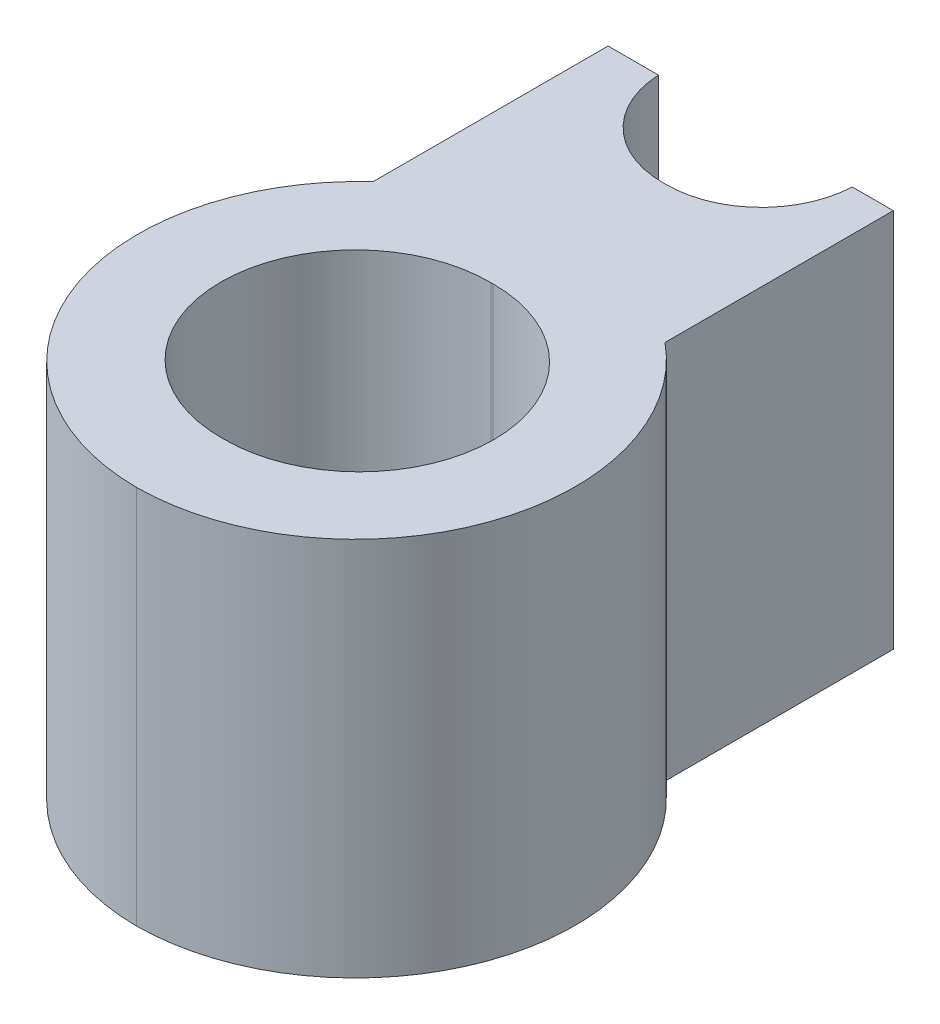
ISO-10303-21;
HEADER;
FILE_DESCRIPTION(('STEP AP214'),'2;1');
FILE_NAME('part.step','',(''),(''),'','','');
FILE_SCHEMA(('AUTOMOTIVE_DESIGN { 1 0 10303 214 1 1 1 1 }'));
ENDSEC;
DATA;
#1=APPLICATION_CONTEXT('core data for automotive mechanical design processes');
#2=APPLICATION_PROTOCOL_DEFINITION('international standard','automotive_design',2000,#1);
#3=PRODUCT_CONTEXT('',#1,'mechanical');
#4=PRODUCT('Part','Part','',(#3));
#5=PRODUCT_RELATED_PRODUCT_CATEGORY('part','',(#4));
#6=PRODUCT_DEFINITION_FORMATION('','',#4);
#7=PRODUCT_DEFINITION_CONTEXT('part definition',#1,'design');
#8=PRODUCT_DEFINITION('design','',#6,#7);
#9=PRODUCT_DEFINITION_SHAPE('','',#8);
#10=(LENGTH_UNIT() NAMED_UNIT(*) SI_UNIT(.MILLI.,.METRE.));
#11=(NAMED_UNIT(*) PLANE_ANGLE_UNIT() SI_UNIT($,.RADIAN.));
#12=(NAMED_UNIT(*) SI_UNIT($,.STERADIAN.) SOLID_ANGLE_UNIT());
#13=UNCERTAINTY_MEASURE_WITH_UNIT(LENGTH_MEASURE(1.E-05),#10,'distance_accuracy_value','');
#14=(GEOMETRIC_REPRESENTATION_CONTEXT(3) GLOBAL_UNCERTAINTY_ASSIGNED_CONTEXT((#13)) GLOBAL_UNIT_ASSIGNED_CONTEXT((#10,
#11,#12)) REPRESENTATION_CONTEXT('',''));
#15=CARTESIAN_POINT('',(0.,0.,0.));
#16=DIRECTION('',(0.,0.,1.));
#17=DIRECTION('',(1.,0.,0.));
#18=AXIS2_PLACEMENT_3D('',#15,#16,#17);
#19=CARTESIAN_POINT('',(1.26536763995187,2.87183105039429,15.59112871048));
#20=DIRECTION('',(0.,1.,0.));
#21=DIRECTION('',(0.,0.,-1.));
#22=AXIS2_PLACEMENT_3D('',#19,#20,#21);
#23=PLANE('',#22);
#24=CARTESIAN_POINT('',(6.25646763995187,2.87183105039429,7.9584287104753));
#25=DIRECTION('',(0.,1.,0.));
#26=DIRECTION('',(0.,0.,1.));
#27=AXIS2_PLACEMENT_3D('',#24,#25,#26);
#28=CIRCLE('',#27,0.425);
#29=CARTESIAN_POINT('',(6.25415936123876,2.87183105039429,8.38342244201684));
#30=VERTEX_POINT('',#29);
#31=CARTESIAN_POINT('',(6.25415936123876,2.87183105039429,7.53343497893376));
#32=VERTEX_POINT('',#31);
#33=EDGE_CURVE('E195',#30,#32,#28,.T.);
#34=ORIENTED_EDGE('',*,*,#33,.F.);
#35=CARTESIAN_POINT('',(6.25185108257199,2.87183105039429,7.9584287104753));
#36=DIRECTION('',(0.,1.,0.));
#37=DIRECTION('',(0.,0.,1.));
#38=AXIS2_PLACEMENT_3D('',#35,#36,#37);
#39=CIRCLE('',#38,0.425);
#40=CARTESIAN_POINT('',(6.24789959947046,2.87183105039429,8.38341034040923));
#41=VERTEX_POINT('',#40);
#42=EDGE_CURVE('E157',#41,#30,#39,.T.);
#43=ORIENTED_EDGE('',*,*,#42,.F.);
#44=CARTESIAN_POINT('',(6.24394811637941,2.87183105039429,7.9584287104753));
#45=DIRECTION('',(0.,1.,0.));
#46=DIRECTION('',(0.,0.,1.));
#47=AXIS2_PLACEMENT_3D('',#44,#45,#46);
#48=CIRCLE('',#47,0.425);
#49=CARTESIAN_POINT('',(6.24789959947046,2.87183105039429,7.53344708054137));
#50=VERTEX_POINT('',#49);
#51=EDGE_CURVE('E151',#50,#41,#48,.T.);
#52=ORIENTED_EDGE('',*,*,#51,.F.);
#53=CARTESIAN_POINT('',(6.25185108257199,2.87183105039429,7.9584287104753));
#54=DIRECTION('',(0.,1.,0.));
#55=DIRECTION('',(0.,0.,1.));
#56=AXIS2_PLACEMENT_3D('',#53,#54,#55);
#57=CIRCLE('',#56,0.425);
#58=EDGE_CURVE('E238',#32,#50,#57,.T.);
#59=ORIENTED_EDGE('',*,*,#58,.F.);
#60=EDGE_LOOP('',(#34,#43,#52,#59));
#61=FACE_BOUND('',#60,.T.);
#62=CARTESIAN_POINT('',(6.24394811637941,2.87183105039429,7.9584287104753));
#63=DIRECTION('',(0.,1.,0.));
#64=DIRECTION('',(0.,0.,1.));
#65=AXIS2_PLACEMENT_3D('',#62,#63,#64);
#66=CIRCLE('',#65,0.694822453073876);
#67=CARTESIAN_POINT('',(6.24789959948481,2.87183105039429,8.65323992733713));
#68=VERTEX_POINT('',#67);
#69=CARTESIAN_POINT('',(6.68582720525889,2.87183105039429,7.42221875895757));
#70=VERTEX_POINT('',#69);
#71=EDGE_CURVE('E140',#68,#70,#66,.T.);
#72=ORIENTED_EDGE('',*,*,#71,.T.);
#73=DIRECTION('',(5.6636748734305E-13,0.,1.));
#74=VECTOR('',#73,1.);
#75=CARTESIAN_POINT('',(6.68582720525848,2.87183105039428,6.70112871047504));
#76=LINE('',#75,#74);
#77=CARTESIAN_POINT('',(6.68582720525848,2.87183105039428,6.70112871047506));
#78=VERTEX_POINT('',#77);
#79=EDGE_CURVE('E138',#78,#70,#76,.T.);
#80=ORIENTED_EDGE('',*,*,#79,.F.);
#81=DIRECTION('',(-1.,0.,1.62432664225037E-12));
#82=VECTOR('',#81,1.);
#83=CARTESIAN_POINT('',(6.69373017145105,2.87183105039428,6.70112871047504));
#84=LINE('',#83,#82);
#85=CARTESIAN_POINT('',(6.55619870275187,2.87183105039428,6.70112871047527));
#86=VERTEX_POINT('',#85);
#87=EDGE_CURVE('E125',#78,#86,#84,.T.);
#88=ORIENTED_EDGE('',*,*,#87,.T.);
#89=CARTESIAN_POINT('',(6.25646763995185,2.87183105039428,6.68842871047526));
#90=DIRECTION('',(0.,1.,0.));
#91=DIRECTION('',(-0.999103542626007,0.,0.0423333333457645));
#92=AXIS2_PLACEMENT_3D('',#89,#90,#91);
#93=CIRCLE('',#92,0.299999999999994);
#94=CARTESIAN_POINT('',(6.25415936127515,2.87183105039429,6.98841983009287));
#95=VERTEX_POINT('',#94);
#96=EDGE_CURVE('E20',#95,#86,#93,.T.);
#97=ORIENTED_EDGE('',*,*,#96,.F.);
#98=CARTESIAN_POINT('',(6.25185108257197,2.87183105039428,6.68842871047528));
#99=DIRECTION('',(0.,1.,0.));
#100=DIRECTION('',(-0.999103542626486,0.,0.0423333333344553));
#101=AXIS2_PLACEMENT_3D('',#98,#99,#100);
#102=CIRCLE('',#101,0.299999999999992);
#103=CARTESIAN_POINT('',(6.24789959947572,2.87183105039429,6.98840268564869));
#104=VERTEX_POINT('',#103);
#105=EDGE_CURVE('E11',#104,#95,#102,.T.);
#106=ORIENTED_EDGE('',*,*,#105,.F.);
#107=CARTESIAN_POINT('',(6.2439481163794,2.87183105039428,6.68842871047528));
#108=DIRECTION('',(0.,1.,0.));
#109=DIRECTION('',(-0.999103542626486,0.,0.0423333333344553));
#110=AXIS2_PLACEMENT_3D('',#107,#108,#109);
#111=CIRCLE('',#110,0.299999999999992);
#112=CARTESIAN_POINT('',(5.94421705359146,2.87183105039428,6.70112871047561));
#113=VERTEX_POINT('',#112);
#114=EDGE_CURVE('E176',#113,#104,#111,.T.);
#115=ORIENTED_EDGE('',*,*,#114,.F.);
#116=DIRECTION('',(1.,0.,1.06337566312106E-12));
#117=VECTOR('',#116,1.);
#118=CARTESIAN_POINT('',(5.78503627868935,2.87183105039428,6.70112871047543));
#119=LINE('',#118,#117);
#120=CARTESIAN_POINT('',(5.78503627868935,2.87183105039428,6.70112871047543));
#121=VERTEX_POINT('',#120);
#122=EDGE_CURVE('E201',#121,#113,#119,.T.);
#123=ORIENTED_EDGE('',*,*,#122,.F.);
#124=DIRECTION('',(-5.02522919053297E-13,0.,1.));
#125=VECTOR('',#124,1.);
#126=CARTESIAN_POINT('',(5.78503627868935,2.87183105039428,6.70112871047543));
#127=LINE('',#126,#125);
#128=CARTESIAN_POINT('',(5.78503627868898,2.87183105039428,7.44378108328629));
#129=VERTEX_POINT('',#128);
#130=EDGE_CURVE('E206',#121,#129,#127,.T.);
#131=ORIENTED_EDGE('',*,*,#130,.T.);
#132=CARTESIAN_POINT('',(6.25185108257199,2.87183105039429,7.9584287104753));
#133=DIRECTION('',(0.,1.,0.));
#134=DIRECTION('',(0.,0.,1.));
#135=AXIS2_PLACEMENT_3D('',#132,#133,#134);
#136=CIRCLE('',#135,0.694822453073876);
#137=EDGE_CURVE('E214',#129,#68,#136,.T.);
#138=ORIENTED_EDGE('',*,*,#137,.T.);
#139=EDGE_LOOP('',(#72,#80,#88,#97,#106,#115,#123,#131,#138));
#140=FACE_BOUND('',#139,.T.);
#141=ADVANCED_FACE('F17',(#61,#140),#23,.T.);
#142=CARTESIAN_POINT('',(6.25185108257197,2.87183105039428,6.68842871047528));
#143=DIRECTION('',(0.,-1.,0.));
#144=DIRECTION('',(-0.999103542626486,0.,0.0423333333344553));
#145=AXIS2_PLACEMENT_3D('',#142,#143,#144);
#146=CYLINDRICAL_SURFACE('',#145,0.299999999999992);
#147=CARTESIAN_POINT('',(6.25185108257197,1.6718310055699,6.68842871047528));
#148=DIRECTION('',(0.,-1.,0.));
#149=DIRECTION('',(-0.999103542626486,0.,0.0423333333344553));
#150=AXIS2_PLACEMENT_3D('',#147,#148,#149);
#151=CIRCLE('',#150,0.299999999999992);
#152=CARTESIAN_POINT('',(6.25415936127516,1.6718310055699,6.98841983009287));
#153=VERTEX_POINT('',#152);
#154=CARTESIAN_POINT('',(6.24789959947573,1.6718310055699,6.98840268564869));
#155=VERTEX_POINT('',#154);
#156=EDGE_CURVE('E181',#153,#155,#151,.T.);
#157=ORIENTED_EDGE('',*,*,#156,.T.);
#158=DIRECTION('',(0.,-1.,0.));
#159=VECTOR('',#158,1.);
#160=CARTESIAN_POINT('',(6.24789959947572,2.87183105039429,6.98840268564869));
#161=LINE('',#160,#159);
#162=EDGE_CURVE('E178',#104,#155,#161,.T.);
#163=ORIENTED_EDGE('',*,*,#162,.F.);
#164=ORIENTED_EDGE('',*,*,#105,.T.);
#165=DIRECTION('',(0.,-1.,0.));
#166=VECTOR('',#165,1.);
#167=CARTESIAN_POINT('',(6.25415936127515,2.87183105039429,6.98841983009287));
#168=LINE('',#167,#166);
#169=EDGE_CURVE('E135',#95,#153,#168,.T.);
#170=ORIENTED_EDGE('',*,*,#169,.T.);
#171=EDGE_LOOP('',(#157,#163,#164,#170));
#172=FACE_BOUND('',#171,.T.);
#173=ADVANCED_FACE('F179',(#172),#146,.F.);
#174=CARTESIAN_POINT('',(6.25646763995185,2.87183105039428,6.68842871047526));
#175=DIRECTION('',(0.,-1.,0.));
#176=DIRECTION('',(-0.999103542626007,0.,0.0423333333457645));
#177=AXIS2_PLACEMENT_3D('',#174,#175,#176);
#178=CYLINDRICAL_SURFACE('',#177,0.299999999999994);
#179=CARTESIAN_POINT('',(6.25646763995185,1.6718310055699,6.68842871047526));
#180=DIRECTION('',(0.,-1.,0.));
#181=DIRECTION('',(-0.999103542626007,0.,0.0423333333457645));
#182=AXIS2_PLACEMENT_3D('',#179,#180,#181);
#183=CIRCLE('',#182,0.299999999999994);
#184=CARTESIAN_POINT('',(6.55619870275188,1.6718310055699,6.70112871047527));
#185=VERTEX_POINT('',#184);
#186=EDGE_CURVE('E274',#185,#153,#183,.T.);
#187=ORIENTED_EDGE('',*,*,#186,.T.);
#188=ORIENTED_EDGE('',*,*,#169,.F.);
#189=ORIENTED_EDGE('',*,*,#96,.T.);
#190=DIRECTION('',(0.,-1.,0.));
#191=VECTOR('',#190,1.);
#192=CARTESIAN_POINT('',(6.55619870275187,2.87183105039428,6.70112871047527));
#193=LINE('',#192,#191);
#194=EDGE_CURVE('E132',#86,#185,#193,.T.);
#195=ORIENTED_EDGE('',*,*,#194,.T.);
#196=EDGE_LOOP('',(#187,#188,#189,#195));
#197=FACE_BOUND('',#196,.T.);
#198=ADVANCED_FACE('F172',(#197),#178,.F.);
#199=CARTESIAN_POINT('',(6.55619870275187,2.87183105039428,6.70112871047527));
#200=DIRECTION('',(-1.62432664225037E-12,0.,-1.));
#201=DIRECTION('',(-1.,0.,1.62432664225037E-12));
#202=AXIS2_PLACEMENT_3D('',#199,#200,#201);
#203=PLANE('',#202);
#204=DIRECTION('',(-1.,0.,1.62432664225037E-12));
#205=VECTOR('',#204,1.);
#206=CARTESIAN_POINT('',(3.91078317134465,1.6718310055699,6.70112871047957));
#207=LINE('',#206,#205);
#208=CARTESIAN_POINT('',(6.68582720525849,1.6718310055699,6.70112871047506));
#209=VERTEX_POINT('',#208);
#210=EDGE_CURVE('E267',#209,#185,#207,.T.);
#211=ORIENTED_EDGE('',*,*,#210,.T.);
#212=ORIENTED_EDGE('',*,*,#194,.F.);
#213=ORIENTED_EDGE('',*,*,#87,.F.);
#214=DIRECTION('',(0.,-1.,0.));
#215=VECTOR('',#214,1.);
#216=CARTESIAN_POINT('',(6.68582720525848,2.87183105039428,6.70112871047506));
#217=LINE('',#216,#215);
#218=EDGE_CURVE('E130',#78,#209,#217,.T.);
#219=ORIENTED_EDGE('',*,*,#218,.T.);
#220=EDGE_LOOP('',(#211,#212,#213,#219));
#221=FACE_BOUND('',#220,.T.);
#222=ADVANCED_FACE('F128',(#221),#203,.T.);
#223=CARTESIAN_POINT('',(6.68582720525848,2.87183105039428,6.70112871047506));
#224=DIRECTION('',(1.,0.,-5.6636748734305E-13));
#225=DIRECTION('',(-5.6636748734305E-13,0.,-1.));
#226=AXIS2_PLACEMENT_3D('',#223,#224,#225);
#227=PLANE('',#226);
#228=DIRECTION('',(-5.6636748734305E-13,0.,-1.));
#229=VECTOR('',#228,1.);
#230=CARTESIAN_POINT('',(6.68582720526099,1.6718310055699,11.146128710476));
#231=LINE('',#230,#229);
#232=CARTESIAN_POINT('',(6.68582720525889,1.6718310055699,7.42221875895757));
#233=VERTEX_POINT('',#232);
#234=EDGE_CURVE('E148',#233,#209,#231,.T.);
#235=ORIENTED_EDGE('',*,*,#234,.T.);
#236=ORIENTED_EDGE('',*,*,#218,.F.);
#237=ORIENTED_EDGE('',*,*,#79,.T.);
#238=DIRECTION('',(0.,-1.,0.));
#239=VECTOR('',#238,1.);
#240=CARTESIAN_POINT('',(6.68582720525889,2.87183105039429,7.42221875895757));
#241=LINE('',#240,#239);
#242=EDGE_CURVE('E217',#70,#233,#241,.T.);
#243=ORIENTED_EDGE('',*,*,#242,.T.);
#244=EDGE_LOOP('',(#235,#236,#237,#243));
#245=FACE_BOUND('',#244,.T.);
#246=ADVANCED_FACE('F146',(#245),#227,.T.);
#247=CARTESIAN_POINT('',(6.24394811637941,2.87183105039429,7.9584287104753));
#248=DIRECTION('',(0.,-1.,0.));
#249=DIRECTION('',(-1.,0.,0.));
#250=AXIS2_PLACEMENT_3D('',#247,#248,#249);
#251=CYLINDRICAL_SURFACE('',#250,0.425);
#252=CARTESIAN_POINT('',(6.24394811637941,1.6718310055699,7.9584287104753));
#253=DIRECTION('',(0.,-1.,0.));
#254=DIRECTION('',(0.,0.,1.));
#255=AXIS2_PLACEMENT_3D('',#252,#253,#254);
#256=CIRCLE('',#255,0.425);
#257=CARTESIAN_POINT('',(6.24789959947047,1.6718310055699,8.38341034040923));
#258=VERTEX_POINT('',#257);
#259=CARTESIAN_POINT('',(6.24789959947047,1.6718310055699,7.53344708054137));
#260=VERTEX_POINT('',#259);
#261=EDGE_CURVE('E264',#258,#260,#256,.T.);
#262=ORIENTED_EDGE('',*,*,#261,.T.);
#263=DIRECTION('',(0.,-1.,0.));
#264=VECTOR('',#263,1.);
#265=CARTESIAN_POINT('',(6.24789959947046,2.87183105039429,7.53344708054137));
#266=LINE('',#265,#264);
#267=EDGE_CURVE('E247',#50,#260,#266,.T.);
#268=ORIENTED_EDGE('',*,*,#267,.F.);
#269=ORIENTED_EDGE('',*,*,#51,.T.);
#270=DIRECTION('',(0.,-1.,0.));
#271=VECTOR('',#270,1.);
#272=CARTESIAN_POINT('',(6.24789959947046,2.87183105039429,8.38341034040923));
#273=LINE('',#272,#271);
#274=EDGE_CURVE('E220',#41,#258,#273,.T.);
#275=ORIENTED_EDGE('',*,*,#274,.T.);
#276=EDGE_LOOP('',(#262,#268,#269,#275));
#277=FACE_BOUND('',#276,.T.);
#278=ADVANCED_FACE('F340',(#277),#251,.F.);
#279=CARTESIAN_POINT('',(6.25185108257199,2.87183105039429,7.9584287104753));
#280=DIRECTION('',(0.,-1.,0.));
#281=DIRECTION('',(0.,0.,1.));
#282=AXIS2_PLACEMENT_3D('',#279,#280,#281);
#283=CYLINDRICAL_SURFACE('',#282,0.425);
#284=CARTESIAN_POINT('',(6.25185108257199,1.6718310055699,7.9584287104753));
#285=DIRECTION('',(0.,-1.,0.));
#286=DIRECTION('',(0.,0.,1.));
#287=AXIS2_PLACEMENT_3D('',#284,#285,#286);
#288=CIRCLE('',#287,0.425);
#289=CARTESIAN_POINT('',(6.25415936123876,1.6718310055699,8.38342244201684));
#290=VERTEX_POINT('',#289);
#291=EDGE_CURVE('E260',#290,#258,#288,.T.);
#292=ORIENTED_EDGE('',*,*,#291,.T.);
#293=ORIENTED_EDGE('',*,*,#274,.F.);
#294=ORIENTED_EDGE('',*,*,#42,.T.);
#295=DIRECTION('',(0.,-1.,0.));
#296=VECTOR('',#295,1.);
#297=CARTESIAN_POINT('',(6.25415936123876,2.87183105039429,8.38342244201684));
#298=LINE('',#297,#296);
#299=EDGE_CURVE('E232',#30,#290,#298,.T.);
#300=ORIENTED_EDGE('',*,*,#299,.T.);
#301=EDGE_LOOP('',(#292,#293,#294,#300));
#302=FACE_BOUND('',#301,.T.);
#303=ADVANCED_FACE('F230',(#302),#283,.F.);
#304=CARTESIAN_POINT('',(6.24394811637941,2.87183105039429,7.9584287104753));
#305=DIRECTION('',(0.,-1.,0.));
#306=DIRECTION('',(0.,0.,1.));
#307=AXIS2_PLACEMENT_3D('',#304,#305,#306);
#308=CYLINDRICAL_SURFACE('',#307,0.694822453073876);
#309=CARTESIAN_POINT('',(6.24394811637941,1.6718310055699,7.9584287104753));
#310=DIRECTION('',(0.,1.,0.));
#311=DIRECTION('',(0.,0.,1.));
#312=AXIS2_PLACEMENT_3D('',#309,#310,#311);
#313=CIRCLE('',#312,0.694822453073876);
#314=CARTESIAN_POINT('',(6.24789959948482,1.6718310055699,8.65323992733713));
#315=VERTEX_POINT('',#314);
#316=EDGE_CURVE('E298',#315,#233,#313,.T.);
#317=ORIENTED_EDGE('',*,*,#316,.T.);
#318=ORIENTED_EDGE('',*,*,#242,.F.);
#319=ORIENTED_EDGE('',*,*,#71,.F.);
#320=DIRECTION('',(0.,-1.,0.));
#321=VECTOR('',#320,1.);
#322=CARTESIAN_POINT('',(6.24789959948481,2.87183105039429,8.65323992733713));
#323=LINE('',#322,#321);
#324=EDGE_CURVE('E210',#68,#315,#323,.T.);
#325=ORIENTED_EDGE('',*,*,#324,.T.);
#326=EDGE_LOOP('',(#317,#318,#319,#325));
#327=FACE_BOUND('',#326,.T.);
#328=ADVANCED_FACE('F331',(#327),#308,.T.);
#329=CARTESIAN_POINT('',(6.25185108257199,2.87183105039429,7.9584287104753));
#330=DIRECTION('',(0.,-1.,0.));
#331=DIRECTION('',(0.,0.,1.));
#332=AXIS2_PLACEMENT_3D('',#329,#330,#331);
#333=CYLINDRICAL_SURFACE('',#332,0.694822453073876);
#334=CARTESIAN_POINT('',(6.25185108257199,1.6718310055699,7.9584287104753));
#335=DIRECTION('',(0.,1.,0.));
#336=DIRECTION('',(0.,0.,1.));
#337=AXIS2_PLACEMENT_3D('',#334,#335,#336);
#338=CIRCLE('',#337,0.694822453073876);
#339=CARTESIAN_POINT('',(5.78503627868899,1.6718310055699,7.44378108328629));
#340=VERTEX_POINT('',#339);
#341=EDGE_CURVE('E294',#340,#315,#338,.T.);
#342=ORIENTED_EDGE('',*,*,#341,.T.);
#343=ORIENTED_EDGE('',*,*,#324,.F.);
#344=ORIENTED_EDGE('',*,*,#137,.F.);
#345=DIRECTION('',(0.,-1.,0.));
#346=VECTOR('',#345,1.);
#347=CARTESIAN_POINT('',(5.78503627868898,2.87183105039428,7.44378108328629));
#348=LINE('',#347,#346);
#349=EDGE_CURVE('E202',#129,#340,#348,.T.);
#350=ORIENTED_EDGE('',*,*,#349,.T.);
#351=EDGE_LOOP('',(#342,#343,#344,#350));
#352=FACE_BOUND('',#351,.T.);
#353=ADVANCED_FACE('F321',(#352),#333,.T.);
#354=CARTESIAN_POINT('',(5.78503627868898,2.87183105039428,7.44378108328629));
#355=DIRECTION('',(-1.,0.,-5.02522919053297E-13));
#356=DIRECTION('',(-5.02522919053297E-13,0.,1.));
#357=AXIS2_PLACEMENT_3D('',#354,#355,#356);
#358=PLANE('',#357);
#359=DIRECTION('',(-5.02522919053297E-13,0.,1.));
#360=VECTOR('',#359,1.);
#361=CARTESIAN_POINT('',(5.78503627868693,1.6718310055699,11.5174548968843));
#362=LINE('',#361,#360);
#363=CARTESIAN_POINT('',(5.78503627868936,1.6718310055699,6.70112871047543));
#364=VERTEX_POINT('',#363);
#365=EDGE_CURVE('E288',#364,#340,#362,.T.);
#366=ORIENTED_EDGE('',*,*,#365,.T.);
#367=ORIENTED_EDGE('',*,*,#349,.F.);
#368=ORIENTED_EDGE('',*,*,#130,.F.);
#369=DIRECTION('',(0.,-1.,0.));
#370=VECTOR('',#369,1.);
#371=CARTESIAN_POINT('',(5.78503627868935,2.87183105039428,6.70112871047543));
#372=LINE('',#371,#370);
#373=EDGE_CURVE('E186',#121,#364,#372,.T.);
#374=ORIENTED_EDGE('',*,*,#373,.T.);
#375=EDGE_LOOP('',(#366,#367,#368,#374));
#376=FACE_BOUND('',#375,.T.);
#377=ADVANCED_FACE('F310',(#376),#358,.T.);
#378=CARTESIAN_POINT('',(5.78503627868935,2.87183105039428,6.70112871047543));
#379=DIRECTION('',(1.06337566312106E-12,0.,-1.));
#380=DIRECTION('',(0.,-1.,0.));
#381=AXIS2_PLACEMENT_3D('',#378,#379,#380);
#382=PLANE('',#381);
#383=DIRECTION('',(-1.,0.,-1.06337566312106E-12));
#384=VECTOR('',#383,1.);
#385=CARTESIAN_POINT('',(3.52520195932534,1.6718310055699,6.70112871047303));
#386=LINE('',#385,#384);
#387=CARTESIAN_POINT('',(5.94421705359147,1.6718310055699,6.70112871047561));
#388=VERTEX_POINT('',#387);
#389=EDGE_CURVE('E284',#388,#364,#386,.T.);
#390=ORIENTED_EDGE('',*,*,#389,.T.);
#391=ORIENTED_EDGE('',*,*,#373,.F.);
#392=ORIENTED_EDGE('',*,*,#122,.T.);
#393=DIRECTION('',(0.,-1.,0.));
#394=VECTOR('',#393,1.);
#395=CARTESIAN_POINT('',(5.94421705359146,2.87183105039428,6.70112871047561));
#396=LINE('',#395,#394);
#397=EDGE_CURVE('E189',#113,#388,#396,.T.);
#398=ORIENTED_EDGE('',*,*,#397,.T.);
#399=EDGE_LOOP('',(#390,#391,#392,#398));
#400=FACE_BOUND('',#399,.T.);
#401=ADVANCED_FACE('F404',(#400),#382,.T.);
#402=CARTESIAN_POINT('',(6.2439481163794,2.87183105039428,6.68842871047528));
#403=DIRECTION('',(0.,-1.,0.));
#404=DIRECTION('',(-0.999103542626486,0.,0.0423333333344553));
#405=AXIS2_PLACEMENT_3D('',#402,#403,#404);
#406=CYLINDRICAL_SURFACE('',#405,0.299999999999992);
#407=CARTESIAN_POINT('',(6.2439481163794,1.6718310055699,6.68842871047528));
#408=DIRECTION('',(0.,-1.,0.));
#409=DIRECTION('',(-0.999103542626486,0.,0.0423333333344553));
#410=AXIS2_PLACEMENT_3D('',#407,#408,#409);
#411=CIRCLE('',#410,0.299999999999992);
#412=EDGE_CURVE('E281',#155,#388,#411,.T.);
#413=ORIENTED_EDGE('',*,*,#412,.T.);
#414=ORIENTED_EDGE('',*,*,#397,.F.);
#415=ORIENTED_EDGE('',*,*,#114,.T.);
#416=ORIENTED_EDGE('',*,*,#162,.T.);
#417=EDGE_LOOP('',(#413,#414,#415,#416));
#418=FACE_BOUND('',#417,.T.);
#419=ADVANCED_FACE('F188',(#418),#406,.F.);
#420=CARTESIAN_POINT('',(6.25646763995187,2.87183105039429,7.9584287104753));
#421=DIRECTION('',(0.,-1.,0.));
#422=DIRECTION('',(1.,0.,0.));
#423=AXIS2_PLACEMENT_3D('',#420,#421,#422);
#424=CYLINDRICAL_SURFACE('',#423,0.425);
#425=CARTESIAN_POINT('',(6.25646763995187,1.6718310055699,7.9584287104753));
#426=DIRECTION('',(0.,-1.,0.));
#427=DIRECTION('',(0.,0.,1.));
#428=AXIS2_PLACEMENT_3D('',#425,#426,#427);
#429=CIRCLE('',#428,0.425);
#430=CARTESIAN_POINT('',(6.25415936123876,1.6718310055699,7.53343497893376));
#431=VERTEX_POINT('',#430);
#432=EDGE_CURVE('E245',#431,#290,#429,.T.);
#433=ORIENTED_EDGE('',*,*,#432,.T.);
#434=ORIENTED_EDGE('',*,*,#299,.F.);
#435=ORIENTED_EDGE('',*,*,#33,.T.);
#436=DIRECTION('',(0.,-1.,0.));
#437=VECTOR('',#436,1.);
#438=CARTESIAN_POINT('',(6.25415936123876,2.87183105039429,7.53343497893376));
#439=LINE('',#438,#437);
#440=EDGE_CURVE('E256',#32,#431,#439,.T.);
#441=ORIENTED_EDGE('',*,*,#440,.T.);
#442=EDGE_LOOP('',(#433,#434,#435,#441));
#443=FACE_BOUND('',#442,.T.);
#444=ADVANCED_FACE('F243',(#443),#424,.F.);
#445=CARTESIAN_POINT('',(6.25185108257199,2.87183105039429,7.9584287104753));
#446=DIRECTION('',(0.,-1.,0.));
#447=DIRECTION('',(-0.00193323411309806,0.,-0.999998131301186));
#448=AXIS2_PLACEMENT_3D('',#445,#446,#447);
#449=CYLINDRICAL_SURFACE('',#448,0.425);
#450=CARTESIAN_POINT('',(6.25185108257199,1.6718310055699,7.9584287104753));
#451=DIRECTION('',(0.,-1.,0.));
#452=DIRECTION('',(0.,0.,1.));
#453=AXIS2_PLACEMENT_3D('',#450,#451,#452);
#454=CIRCLE('',#453,0.425);
#455=EDGE_CURVE('E271',#260,#431,#454,.T.);
#456=ORIENTED_EDGE('',*,*,#455,.T.);
#457=ORIENTED_EDGE('',*,*,#440,.F.);
#458=ORIENTED_EDGE('',*,*,#58,.T.);
#459=ORIENTED_EDGE('',*,*,#267,.T.);
#460=EDGE_LOOP('',(#456,#457,#458,#459));
#461=FACE_BOUND('',#460,.T.);
#462=ADVANCED_FACE('F433',(#461),#449,.F.);
#463=CARTESIAN_POINT('',(1.26536763995188,1.6718310055699,15.59112871048));
#464=DIRECTION('',(0.,1.,0.));
#465=DIRECTION('',(0.,0.,-1.));
#466=AXIS2_PLACEMENT_3D('',#463,#464,#465);
#467=PLANE('',#466);
#468=ORIENTED_EDGE('',*,*,#432,.F.);
#469=ORIENTED_EDGE('',*,*,#455,.F.);
#470=ORIENTED_EDGE('',*,*,#261,.F.);
#471=ORIENTED_EDGE('',*,*,#291,.F.);
#472=EDGE_LOOP('',(#468,#469,#470,#471));
#473=FACE_BOUND('',#472,.T.);
#474=ORIENTED_EDGE('',*,*,#316,.F.);
#475=ORIENTED_EDGE('',*,*,#341,.F.);
#476=ORIENTED_EDGE('',*,*,#365,.F.);
#477=ORIENTED_EDGE('',*,*,#389,.F.);
#478=ORIENTED_EDGE('',*,*,#412,.F.);
#479=ORIENTED_EDGE('',*,*,#156,.F.);
#480=ORIENTED_EDGE('',*,*,#186,.F.);
#481=ORIENTED_EDGE('',*,*,#210,.F.);
#482=ORIENTED_EDGE('',*,*,#234,.F.);
#483=EDGE_LOOP('',(#474,#475,#476,#477,#478,#479,#480,#481,#482));
#484=FACE_BOUND('',#483,.T.);
#485=ADVANCED_FACE('F317',(#473,#484),#467,.F.);
#486=CLOSED_SHELL('',(#141,#173,#198,#222,#246,#278,#303,#328,#353,#377,#401,#419,#444,#462,#485));
#487=MANIFOLD_SOLID_BREP('B1',#486);
#488=ADVANCED_BREP_SHAPE_REPRESENTATION('',(#18,#487),#14);
#489=SHAPE_DEFINITION_REPRESENTATION(#9,#488);
ENDSEC;
END-ISO-10303-21;
